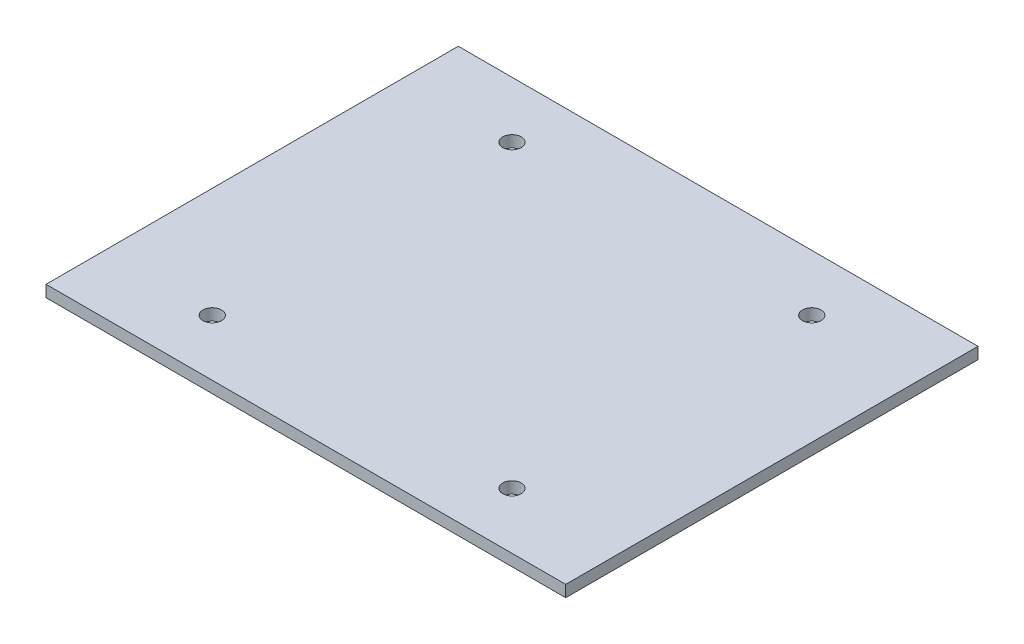
ISO-10303-21;
HEADER;
FILE_DESCRIPTION(('STEP AP214'),'2;1');
FILE_NAME('part.step','',(''),(''),'','','');
FILE_SCHEMA(('AUTOMOTIVE_DESIGN { 1 0 10303 214 1 1 1 1 }'));
ENDSEC;
DATA;
#1=APPLICATION_CONTEXT('core data for automotive mechanical design processes');
#2=APPLICATION_PROTOCOL_DEFINITION('international standard','automotive_design',2000,#1);
#3=PRODUCT_CONTEXT('',#1,'mechanical');
#4=PRODUCT('Part','Part','',(#3));
#5=PRODUCT_RELATED_PRODUCT_CATEGORY('part','',(#4));
#6=PRODUCT_DEFINITION_FORMATION('','',#4);
#7=PRODUCT_DEFINITION_CONTEXT('part definition',#1,'design');
#8=PRODUCT_DEFINITION('design','',#6,#7);
#9=PRODUCT_DEFINITION_SHAPE('','',#8);
#10=(LENGTH_UNIT() NAMED_UNIT(*) SI_UNIT(.MILLI.,.METRE.));
#11=(NAMED_UNIT(*) PLANE_ANGLE_UNIT() SI_UNIT($,.RADIAN.));
#12=(NAMED_UNIT(*) SI_UNIT($,.STERADIAN.) SOLID_ANGLE_UNIT());
#13=UNCERTAINTY_MEASURE_WITH_UNIT(LENGTH_MEASURE(1.E-05),#10,'distance_accuracy_value','');
#14=(GEOMETRIC_REPRESENTATION_CONTEXT(3) GLOBAL_UNCERTAINTY_ASSIGNED_CONTEXT((#13)) GLOBAL_UNIT_ASSIGNED_CONTEXT((#10,
#11,#12)) REPRESENTATION_CONTEXT('',''));
#15=CARTESIAN_POINT('',(0.,0.,0.));
#16=DIRECTION('',(0.,0.,1.));
#17=DIRECTION('',(1.,0.,0.));
#18=AXIS2_PLACEMENT_3D('',#15,#16,#17);
#19=CARTESIAN_POINT('',(38.0750384082771,2.,12.1977159935547));
#20=DIRECTION('',(0.,1.,0.));
#21=DIRECTION('',(0.,0.,1.));
#22=AXIS2_PLACEMENT_3D('',#19,#20,#21);
#23=PLANE('',#22);
#24=CARTESIAN_POINT('',(-32.4843591050319,2.,21.8883184802458));
#25=DIRECTION('',(0.,1.,0.));
#26=DIRECTION('',(0.,0.,1.));
#27=AXIS2_PLACEMENT_3D('',#24,#25,#26);
#28=CIRCLE('',#27,1.6);
#29=CARTESIAN_POINT('',(-32.4843591050319,2.,23.4883184802458));
#30=VERTEX_POINT('',#29);
#31=EDGE_CURVE('E121',#30,#30,#28,.T.);
#32=ORIENTED_EDGE('',*,*,#31,.F.);
#33=EDGE_LOOP('',(#32));
#34=FACE_BOUND('',#33,.T.);
#35=CARTESIAN_POINT('',(19.1344359215864,2.,73.5071135068633));
#36=DIRECTION('',(0.,1.,0.));
#37=DIRECTION('',(0.,0.,1.));
#38=AXIS2_PLACEMENT_3D('',#35,#36,#37);
#39=CIRCLE('',#38,1.6);
#40=CARTESIAN_POINT('',(19.1344359215864,2.,75.1071135068633));
#41=VERTEX_POINT('',#40);
#42=EDGE_CURVE('E100',#41,#41,#39,.T.);
#43=ORIENTED_EDGE('',*,*,#42,.F.);
#44=EDGE_LOOP('',(#43));
#45=FACE_BOUND('',#44,.T.);
#46=DIRECTION('',(0.,0.,-1.));
#47=VECTOR('',#46,1.);
#48=CARTESIAN_POINT('',(38.0750384082771,2.,83.1977159935547));
#49=LINE('',#48,#47);
#50=CARTESIAN_POINT('',(38.0750384082771,2.,83.1977159935547));
#51=VERTEX_POINT('',#50);
#52=CARTESIAN_POINT('',(38.0750384082771,2.,12.1977159935547));
#53=VERTEX_POINT('',#52);
#54=EDGE_CURVE('E85',#51,#53,#49,.T.);
#55=ORIENTED_EDGE('',*,*,#54,.T.);
#56=DIRECTION('',(-1.,0.,0.));
#57=VECTOR('',#56,1.);
#58=CARTESIAN_POINT('',(38.0750384082771,2.,12.1977159935547));
#59=LINE('',#58,#57);
#60=CARTESIAN_POINT('',(-51.4249615917229,2.,12.1977159935547));
#61=VERTEX_POINT('',#60);
#62=EDGE_CURVE('E80',#53,#61,#59,.T.);
#63=ORIENTED_EDGE('',*,*,#62,.T.);
#64=DIRECTION('',(0.,0.,1.));
#65=VECTOR('',#64,1.);
#66=CARTESIAN_POINT('',(-51.4249615917229,2.,83.1977159935547));
#67=LINE('',#66,#65);
#68=CARTESIAN_POINT('',(-51.4249615917229,2.,83.1977159935547));
#69=VERTEX_POINT('',#68);
#70=EDGE_CURVE('E83',#61,#69,#67,.T.);
#71=ORIENTED_EDGE('',*,*,#70,.T.);
#72=DIRECTION('',(1.,0.,0.));
#73=VECTOR('',#72,1.);
#74=CARTESIAN_POINT('',(38.0750384082771,2.,83.1977159935547));
#75=LINE('',#74,#73);
#76=EDGE_CURVE('E50',#69,#51,#75,.T.);
#77=ORIENTED_EDGE('',*,*,#76,.T.);
#78=EDGE_LOOP('',(#55,#63,#71,#77));
#79=FACE_BOUND('',#78,.T.);
#80=CARTESIAN_POINT('',(-32.4843591050315,2.,73.507113506864));
#81=DIRECTION('',(0.,1.,0.));
#82=DIRECTION('',(0.,0.,1.));
#83=AXIS2_PLACEMENT_3D('',#80,#81,#82);
#84=CIRCLE('',#83,1.6);
#85=CARTESIAN_POINT('',(-32.4843591050315,2.,75.107113506864));
#86=VERTEX_POINT('',#85);
#87=EDGE_CURVE('E115',#86,#86,#84,.T.);
#88=ORIENTED_EDGE('',*,*,#87,.F.);
#89=EDGE_LOOP('',(#88));
#90=FACE_BOUND('',#89,.T.);
#91=CARTESIAN_POINT('',(19.1344359215861,2.,21.8883184802457));
#92=DIRECTION('',(0.,1.,0.));
#93=DIRECTION('',(0.,0.,1.));
#94=AXIS2_PLACEMENT_3D('',#91,#92,#93);
#95=CIRCLE('',#94,1.59999999999996);
#96=CARTESIAN_POINT('',(19.1344359215861,2.,23.4883184802456));
#97=VERTEX_POINT('',#96);
#98=EDGE_CURVE('E127',#97,#97,#95,.T.);
#99=ORIENTED_EDGE('',*,*,#98,.F.);
#100=EDGE_LOOP('',(#99));
#101=FACE_BOUND('',#100,.T.);
#102=ADVANCED_FACE('F33',(#34,#45,#79,#90,#101),#23,.T.);
#103=CARTESIAN_POINT('',(38.0750384082771,0.,12.1977159935547));
#104=DIRECTION('',(0.,1.,0.));
#105=DIRECTION('',(0.,0.,1.));
#106=AXIS2_PLACEMENT_3D('',#103,#104,#105);
#107=PLANE('',#106);
#108=CARTESIAN_POINT('',(-32.4843591050319,0.,21.8883184802458));
#109=DIRECTION('',(0.,1.,0.));
#110=DIRECTION('',(0.,0.,1.));
#111=AXIS2_PLACEMENT_3D('',#108,#109,#110);
#112=CIRCLE('',#111,1.6);
#113=CARTESIAN_POINT('',(-32.4843591050319,0.,23.4883184802458));
#114=VERTEX_POINT('',#113);
#115=EDGE_CURVE('E124',#114,#114,#112,.T.);
#116=ORIENTED_EDGE('',*,*,#115,.T.);
#117=EDGE_LOOP('',(#116));
#118=FACE_BOUND('',#117,.T.);
#119=CARTESIAN_POINT('',(19.1344359215864,0.,73.5071135068633));
#120=DIRECTION('',(0.,1.,0.));
#121=DIRECTION('',(0.,0.,1.));
#122=AXIS2_PLACEMENT_3D('',#119,#120,#121);
#123=CIRCLE('',#122,1.6);
#124=CARTESIAN_POINT('',(19.1344359215864,0.,75.1071135068633));
#125=VERTEX_POINT('',#124);
#126=EDGE_CURVE('E112',#125,#125,#123,.T.);
#127=ORIENTED_EDGE('',*,*,#126,.T.);
#128=EDGE_LOOP('',(#127));
#129=FACE_BOUND('',#128,.T.);
#130=DIRECTION('',(0.,0.,-1.));
#131=VECTOR('',#130,1.);
#132=CARTESIAN_POINT('',(38.0750384082771,0.,83.1977159935547));
#133=LINE('',#132,#131);
#134=CARTESIAN_POINT('',(38.0750384082771,0.,83.1977159935547));
#135=VERTEX_POINT('',#134);
#136=CARTESIAN_POINT('',(38.0750384082771,0.,12.1977159935547));
#137=VERTEX_POINT('',#136);
#138=EDGE_CURVE('E97',#135,#137,#133,.T.);
#139=ORIENTED_EDGE('',*,*,#138,.F.);
#140=DIRECTION('',(1.,0.,0.));
#141=VECTOR('',#140,1.);
#142=CARTESIAN_POINT('',(38.0750384082771,0.,83.1977159935547));
#143=LINE('',#142,#141);
#144=CARTESIAN_POINT('',(-51.4249615917229,0.,83.1977159935547));
#145=VERTEX_POINT('',#144);
#146=EDGE_CURVE('E73',#145,#135,#143,.T.);
#147=ORIENTED_EDGE('',*,*,#146,.F.);
#148=DIRECTION('',(0.,0.,1.));
#149=VECTOR('',#148,1.);
#150=CARTESIAN_POINT('',(-51.4249615917229,0.,83.1977159935547));
#151=LINE('',#150,#149);
#152=CARTESIAN_POINT('',(-51.4249615917229,0.,12.1977159935547));
#153=VERTEX_POINT('',#152);
#154=EDGE_CURVE('E67',#153,#145,#151,.T.);
#155=ORIENTED_EDGE('',*,*,#154,.F.);
#156=DIRECTION('',(-1.,0.,0.));
#157=VECTOR('',#156,1.);
#158=CARTESIAN_POINT('',(38.0750384082771,0.,12.1977159935547));
#159=LINE('',#158,#157);
#160=EDGE_CURVE('E89',#137,#153,#159,.T.);
#161=ORIENTED_EDGE('',*,*,#160,.F.);
#162=EDGE_LOOP('',(#139,#147,#155,#161));
#163=FACE_BOUND('',#162,.T.);
#164=CARTESIAN_POINT('',(-32.4843591050315,0.,73.507113506864));
#165=DIRECTION('',(0.,1.,0.));
#166=DIRECTION('',(0.,0.,1.));
#167=AXIS2_PLACEMENT_3D('',#164,#165,#166);
#168=CIRCLE('',#167,1.6);
#169=CARTESIAN_POINT('',(-32.4843591050315,0.,75.107113506864));
#170=VERTEX_POINT('',#169);
#171=EDGE_CURVE('E118',#170,#170,#168,.T.);
#172=ORIENTED_EDGE('',*,*,#171,.T.);
#173=EDGE_LOOP('',(#172));
#174=FACE_BOUND('',#173,.T.);
#175=CARTESIAN_POINT('',(19.1344359215861,0.,21.8883184802457));
#176=DIRECTION('',(0.,1.,0.));
#177=DIRECTION('',(0.,0.,1.));
#178=AXIS2_PLACEMENT_3D('',#175,#176,#177);
#179=CIRCLE('',#178,1.59999999999996);
#180=CARTESIAN_POINT('',(19.1344359215861,0.,23.4883184802456));
#181=VERTEX_POINT('',#180);
#182=EDGE_CURVE('E130',#181,#181,#179,.T.);
#183=ORIENTED_EDGE('',*,*,#182,.T.);
#184=EDGE_LOOP('',(#183));
#185=FACE_BOUND('',#184,.T.);
#186=ADVANCED_FACE('F108',(#118,#129,#163,#174,#185),#107,.F.);
#187=CARTESIAN_POINT('',(38.0750384082771,2.,83.1977159935547));
#188=DIRECTION('',(-1.,0.,0.));
#189=DIRECTION('',(0.,0.,1.));
#190=AXIS2_PLACEMENT_3D('',#187,#188,#189);
#191=PLANE('',#190);
#192=ORIENTED_EDGE('',*,*,#138,.T.);
#193=DIRECTION('',(0.,-1.,0.));
#194=VECTOR('',#193,1.);
#195=CARTESIAN_POINT('',(38.0750384082771,2.,12.1977159935547));
#196=LINE('',#195,#194);
#197=EDGE_CURVE('E11',#53,#137,#196,.T.);
#198=ORIENTED_EDGE('',*,*,#197,.F.);
#199=ORIENTED_EDGE('',*,*,#54,.F.);
#200=DIRECTION('',(0.,-1.,0.));
#201=VECTOR('',#200,1.);
#202=CARTESIAN_POINT('',(38.0750384082771,2.,83.1977159935547));
#203=LINE('',#202,#201);
#204=EDGE_CURVE('E93',#51,#135,#203,.T.);
#205=ORIENTED_EDGE('',*,*,#204,.T.);
#206=EDGE_LOOP('',(#192,#198,#199,#205));
#207=FACE_BOUND('',#206,.T.);
#208=ADVANCED_FACE('F35',(#207),#191,.F.);
#209=CARTESIAN_POINT('',(38.0750384082771,2.,12.1977159935547));
#210=DIRECTION('',(0.,0.,1.));
#211=DIRECTION('',(1.,0.,0.));
#212=AXIS2_PLACEMENT_3D('',#209,#210,#211);
#213=PLANE('',#212);
#214=ORIENTED_EDGE('',*,*,#160,.T.);
#215=DIRECTION('',(0.,-1.,0.));
#216=VECTOR('',#215,1.);
#217=CARTESIAN_POINT('',(-51.4249615917229,2.,12.1977159935547));
#218=LINE('',#217,#216);
#219=EDGE_CURVE('E42',#61,#153,#218,.T.);
#220=ORIENTED_EDGE('',*,*,#219,.F.);
#221=ORIENTED_EDGE('',*,*,#62,.F.);
#222=ORIENTED_EDGE('',*,*,#197,.T.);
#223=EDGE_LOOP('',(#214,#220,#221,#222));
#224=FACE_BOUND('',#223,.T.);
#225=ADVANCED_FACE('F88',(#224),#213,.F.);
#226=CARTESIAN_POINT('',(-51.4249615917229,2.,83.1977159935547));
#227=DIRECTION('',(1.,0.,0.));
#228=DIRECTION('',(0.,0.,-1.));
#229=AXIS2_PLACEMENT_3D('',#226,#227,#228);
#230=PLANE('',#229);
#231=ORIENTED_EDGE('',*,*,#154,.T.);
#232=DIRECTION('',(0.,-1.,0.));
#233=VECTOR('',#232,1.);
#234=CARTESIAN_POINT('',(-51.4249615917229,2.,83.1977159935547));
#235=LINE('',#234,#233);
#236=EDGE_CURVE('E90',#69,#145,#235,.T.);
#237=ORIENTED_EDGE('',*,*,#236,.F.);
#238=ORIENTED_EDGE('',*,*,#70,.F.);
#239=ORIENTED_EDGE('',*,*,#219,.T.);
#240=EDGE_LOOP('',(#231,#237,#238,#239));
#241=FACE_BOUND('',#240,.T.);
#242=ADVANCED_FACE('F91',(#241),#230,.F.);
#243=CARTESIAN_POINT('',(38.0750384082771,2.,83.1977159935547));
#244=DIRECTION('',(0.,0.,-1.));
#245=DIRECTION('',(-1.,0.,0.));
#246=AXIS2_PLACEMENT_3D('',#243,#244,#245);
#247=PLANE('',#246);
#248=ORIENTED_EDGE('',*,*,#146,.T.);
#249=ORIENTED_EDGE('',*,*,#204,.F.);
#250=ORIENTED_EDGE('',*,*,#76,.F.);
#251=ORIENTED_EDGE('',*,*,#236,.T.);
#252=EDGE_LOOP('',(#248,#249,#250,#251));
#253=FACE_BOUND('',#252,.T.);
#254=ADVANCED_FACE('F105',(#253),#247,.F.);
#255=CARTESIAN_POINT('',(19.1344359215864,2.,73.5071135068633));
#256=DIRECTION('',(0.,-1.,0.));
#257=DIRECTION('',(0.,0.,-1.));
#258=AXIS2_PLACEMENT_3D('',#255,#256,#257);
#259=CYLINDRICAL_SURFACE('',#258,1.6);
#260=ORIENTED_EDGE('',*,*,#42,.T.);
#261=EDGE_LOOP('',(#260));
#262=FACE_BOUND('',#261,.T.);
#263=ORIENTED_EDGE('',*,*,#126,.F.);
#264=EDGE_LOOP('',(#263));
#265=FACE_BOUND('',#264,.T.);
#266=ADVANCED_FACE('F150',(#262,#265),#259,.F.);
#267=CARTESIAN_POINT('',(-32.4843591050315,2.,73.507113506864));
#268=DIRECTION('',(0.,-1.,0.));
#269=DIRECTION('',(0.,0.,-1.));
#270=AXIS2_PLACEMENT_3D('',#267,#268,#269);
#271=CYLINDRICAL_SURFACE('',#270,1.6);
#272=ORIENTED_EDGE('',*,*,#87,.T.);
#273=EDGE_LOOP('',(#272));
#274=FACE_BOUND('',#273,.T.);
#275=ORIENTED_EDGE('',*,*,#171,.F.);
#276=EDGE_LOOP('',(#275));
#277=FACE_BOUND('',#276,.T.);
#278=ADVANCED_FACE('F196',(#274,#277),#271,.F.);
#279=CARTESIAN_POINT('',(-32.4843591050319,2.,21.8883184802458));
#280=DIRECTION('',(0.,-1.,0.));
#281=DIRECTION('',(0.,0.,-1.));
#282=AXIS2_PLACEMENT_3D('',#279,#280,#281);
#283=CYLINDRICAL_SURFACE('',#282,1.6);
#284=ORIENTED_EDGE('',*,*,#31,.T.);
#285=EDGE_LOOP('',(#284));
#286=FACE_BOUND('',#285,.T.);
#287=ORIENTED_EDGE('',*,*,#115,.F.);
#288=EDGE_LOOP('',(#287));
#289=FACE_BOUND('',#288,.T.);
#290=ADVANCED_FACE('F204',(#286,#289),#283,.F.);
#291=CARTESIAN_POINT('',(19.1344359215861,2.,21.8883184802457));
#292=DIRECTION('',(0.,-1.,0.));
#293=DIRECTION('',(0.,0.,-1.));
#294=AXIS2_PLACEMENT_3D('',#291,#292,#293);
#295=CYLINDRICAL_SURFACE('',#294,1.59999999999996);
#296=ORIENTED_EDGE('',*,*,#98,.T.);
#297=EDGE_LOOP('',(#296));
#298=FACE_BOUND('',#297,.T.);
#299=ORIENTED_EDGE('',*,*,#182,.F.);
#300=EDGE_LOOP('',(#299));
#301=FACE_BOUND('',#300,.T.);
#302=ADVANCED_FACE('F136',(#298,#301),#295,.F.);
#303=CLOSED_SHELL('',(#102,#186,#208,#225,#242,#254,#266,#278,#290,#302));
#304=MANIFOLD_SOLID_BREP('B2',#303);
#305=ADVANCED_BREP_SHAPE_REPRESENTATION('',(#18,#304),#14);
#306=SHAPE_DEFINITION_REPRESENTATION(#9,#305);
ENDSEC;
END-ISO-10303-21;
